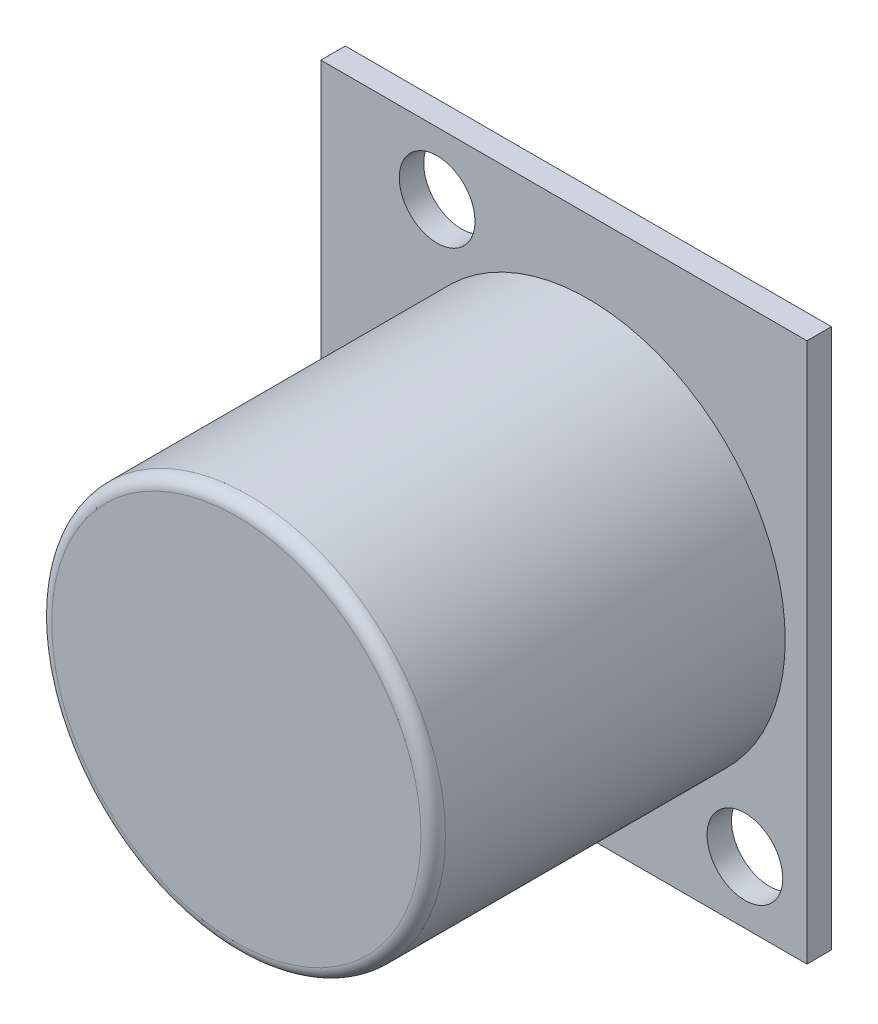
ISO-10303-21;
HEADER;
FILE_DESCRIPTION(('STEP AP214'),'2;1');
FILE_NAME('part.step','',(''),(''),'','','');
FILE_SCHEMA(('AUTOMOTIVE_DESIGN { 1 0 10303 214 1 1 1 1 }'));
ENDSEC;
DATA;
#1=APPLICATION_CONTEXT('core data for automotive mechanical design processes');
#2=APPLICATION_PROTOCOL_DEFINITION('international standard','automotive_design',2000,#1);
#3=PRODUCT_CONTEXT('',#1,'mechanical');
#4=PRODUCT('Part','Part','',(#3));
#5=PRODUCT_RELATED_PRODUCT_CATEGORY('part','',(#4));
#6=PRODUCT_DEFINITION_FORMATION('','',#4);
#7=PRODUCT_DEFINITION_CONTEXT('part definition',#1,'design');
#8=PRODUCT_DEFINITION('design','',#6,#7);
#9=PRODUCT_DEFINITION_SHAPE('','',#8);
#10=(LENGTH_UNIT() NAMED_UNIT(*) SI_UNIT(.MILLI.,.METRE.));
#11=(NAMED_UNIT(*) PLANE_ANGLE_UNIT() SI_UNIT($,.RADIAN.));
#12=(NAMED_UNIT(*) SI_UNIT($,.STERADIAN.) SOLID_ANGLE_UNIT());
#13=UNCERTAINTY_MEASURE_WITH_UNIT(LENGTH_MEASURE(1.E-05),#10,'distance_accuracy_value','');
#14=(GEOMETRIC_REPRESENTATION_CONTEXT(3) GLOBAL_UNCERTAINTY_ASSIGNED_CONTEXT((#13)) GLOBAL_UNIT_ASSIGNED_CONTEXT((#10,
#11,#12)) REPRESENTATION_CONTEXT('',''));
#15=CARTESIAN_POINT('',(0.,0.,0.));
#16=DIRECTION('',(0.,0.,1.));
#17=DIRECTION('',(1.,0.,0.));
#18=AXIS2_PLACEMENT_3D('',#15,#16,#17);
#19=CARTESIAN_POINT('',(0.,-22.1,1.));
#20=DIRECTION('',(0.,0.,1.));
#21=DIRECTION('',(1.,0.,0.));
#22=AXIS2_PLACEMENT_3D('',#19,#20,#21);
#23=PLANE('',#22);
#24=DIRECTION('',(0.,-1.,0.));
#25=VECTOR('',#24,1.);
#26=CARTESIAN_POINT('',(0.,0.,1.));
#27=LINE('',#26,#25);
#28=CARTESIAN_POINT('',(0.,0.,1.));
#29=VERTEX_POINT('',#28);
#30=CARTESIAN_POINT('',(0.,-22.1,1.));
#31=VERTEX_POINT('',#30);
#32=EDGE_CURVE('E84',#29,#31,#27,.T.);
#33=ORIENTED_EDGE('',*,*,#32,.T.);
#34=DIRECTION('',(1.,0.,0.));
#35=VECTOR('',#34,1.);
#36=CARTESIAN_POINT('',(0.,-22.1,1.));
#37=LINE('',#36,#35);
#38=CARTESIAN_POINT('',(19.9,-22.1,1.));
#39=VERTEX_POINT('',#38);
#40=EDGE_CURVE('E79',#31,#39,#37,.T.);
#41=ORIENTED_EDGE('',*,*,#40,.T.);
#42=DIRECTION('',(0.,1.,0.));
#43=VECTOR('',#42,1.);
#44=CARTESIAN_POINT('',(19.9,0.,1.));
#45=LINE('',#44,#43);
#46=CARTESIAN_POINT('',(19.9,0.,1.));
#47=VERTEX_POINT('',#46);
#48=EDGE_CURVE('E82',#39,#47,#45,.T.);
#49=ORIENTED_EDGE('',*,*,#48,.T.);
#50=DIRECTION('',(-1.,0.,0.));
#51=VECTOR('',#50,1.);
#52=CARTESIAN_POINT('',(0.,0.,1.));
#53=LINE('',#52,#51);
#54=EDGE_CURVE('E48',#47,#29,#53,.T.);
#55=ORIENTED_EDGE('',*,*,#54,.T.);
#56=EDGE_LOOP('',(#33,#41,#49,#55));
#57=FACE_BOUND('',#56,.T.);
#58=CARTESIAN_POINT('',(4.76,-2.56,1.));
#59=DIRECTION('',(0.,0.,1.));
#60=DIRECTION('',(1.,0.,0.));
#61=AXIS2_PLACEMENT_3D('',#58,#59,#60);
#62=CIRCLE('',#61,1.55);
#63=CARTESIAN_POINT('',(6.31,-2.56,1.));
#64=VERTEX_POINT('',#63);
#65=EDGE_CURVE('E224',#64,#64,#62,.T.);
#66=ORIENTED_EDGE('',*,*,#65,.F.);
#67=EDGE_LOOP('',(#66));
#68=FACE_BOUND('',#67,.T.);
#69=CARTESIAN_POINT('',(17.36,-19.56,1.));
#70=DIRECTION('',(0.,0.,1.));
#71=DIRECTION('',(1.,0.,0.));
#72=AXIS2_PLACEMENT_3D('',#69,#70,#71);
#73=CIRCLE('',#72,1.55);
#74=CARTESIAN_POINT('',(18.91,-19.56,1.));
#75=VERTEX_POINT('',#74);
#76=EDGE_CURVE('E217',#75,#75,#73,.T.);
#77=ORIENTED_EDGE('',*,*,#76,.F.);
#78=EDGE_LOOP('',(#77));
#79=FACE_BOUND('',#78,.T.);
#80=CARTESIAN_POINT('',(10.95,-11.05,1.));
#81=DIRECTION('',(0.,0.,1.));
#82=DIRECTION('',(1.,0.,0.));
#83=AXIS2_PLACEMENT_3D('',#80,#81,#82);
#84=CIRCLE('',#83,8.06);
#85=CARTESIAN_POINT('',(19.01,-11.05,1.));
#86=VERTEX_POINT('',#85);
#87=EDGE_CURVE('E215',#86,#86,#84,.T.);
#88=ORIENTED_EDGE('',*,*,#87,.F.);
#89=EDGE_LOOP('',(#88));
#90=FACE_BOUND('',#89,.T.);
#91=ADVANCED_FACE('F31',(#57,#68,#79,#90),#23,.T.);
#92=CARTESIAN_POINT('',(0.,0.,1.));
#93=DIRECTION('',(1.,0.,0.));
#94=DIRECTION('',(0.,1.,0.));
#95=AXIS2_PLACEMENT_3D('',#92,#93,#94);
#96=PLANE('',#95);
#97=DIRECTION('',(0.,-1.,0.));
#98=VECTOR('',#97,1.);
#99=CARTESIAN_POINT('',(0.,0.,0.));
#100=LINE('',#99,#98);
#101=CARTESIAN_POINT('',(0.,0.,0.));
#102=VERTEX_POINT('',#101);
#103=CARTESIAN_POINT('',(0.,-22.1,0.));
#104=VERTEX_POINT('',#103);
#105=EDGE_CURVE('E99',#102,#104,#100,.T.);
#106=ORIENTED_EDGE('',*,*,#105,.T.);
#107=DIRECTION('',(0.,0.,-1.));
#108=VECTOR('',#107,1.);
#109=CARTESIAN_POINT('',(0.,-22.1,1.));
#110=LINE('',#109,#108);
#111=EDGE_CURVE('E90',#31,#104,#110,.T.);
#112=ORIENTED_EDGE('',*,*,#111,.F.);
#113=ORIENTED_EDGE('',*,*,#32,.F.);
#114=DIRECTION('',(0.,0.,-1.));
#115=VECTOR('',#114,1.);
#116=CARTESIAN_POINT('',(0.,0.,1.));
#117=LINE('',#116,#115);
#118=EDGE_CURVE('E95',#29,#102,#117,.T.);
#119=ORIENTED_EDGE('',*,*,#118,.T.);
#120=EDGE_LOOP('',(#106,#112,#113,#119));
#121=FACE_BOUND('',#120,.T.);
#122=ADVANCED_FACE('F122',(#121),#96,.F.);
#123=CARTESIAN_POINT('',(0.,-22.1,1.));
#124=DIRECTION('',(0.,1.,0.));
#125=DIRECTION('',(0.,0.,1.));
#126=AXIS2_PLACEMENT_3D('',#123,#124,#125);
#127=PLANE('',#126);
#128=DIRECTION('',(1.,0.,0.));
#129=VECTOR('',#128,1.);
#130=CARTESIAN_POINT('',(0.,-22.1,0.));
#131=LINE('',#130,#129);
#132=CARTESIAN_POINT('',(19.9,-22.1,0.));
#133=VERTEX_POINT('',#132);
#134=EDGE_CURVE('E89',#104,#133,#131,.T.);
#135=ORIENTED_EDGE('',*,*,#134,.T.);
#136=DIRECTION('',(0.,0.,-1.));
#137=VECTOR('',#136,1.);
#138=CARTESIAN_POINT('',(19.9,-22.1,1.));
#139=LINE('',#138,#137);
#140=EDGE_CURVE('E87',#39,#133,#139,.T.);
#141=ORIENTED_EDGE('',*,*,#140,.F.);
#142=ORIENTED_EDGE('',*,*,#40,.F.);
#143=ORIENTED_EDGE('',*,*,#111,.T.);
#144=EDGE_LOOP('',(#135,#141,#142,#143));
#145=FACE_BOUND('',#144,.T.);
#146=ADVANCED_FACE('F88',(#145),#127,.F.);
#147=CARTESIAN_POINT('',(19.9,0.,1.));
#148=DIRECTION('',(-1.,0.,0.));
#149=DIRECTION('',(0.,0.,1.));
#150=AXIS2_PLACEMENT_3D('',#147,#148,#149);
#151=PLANE('',#150);
#152=DIRECTION('',(0.,1.,0.));
#153=VECTOR('',#152,1.);
#154=CARTESIAN_POINT('',(19.9,0.,0.));
#155=LINE('',#154,#153);
#156=CARTESIAN_POINT('',(19.9,0.,0.));
#157=VERTEX_POINT('',#156);
#158=EDGE_CURVE('E65',#133,#157,#155,.T.);
#159=ORIENTED_EDGE('',*,*,#158,.T.);
#160=DIRECTION('',(0.,0.,-1.));
#161=VECTOR('',#160,1.);
#162=CARTESIAN_POINT('',(19.9,0.,1.));
#163=LINE('',#162,#161);
#164=EDGE_CURVE('E91',#47,#157,#163,.T.);
#165=ORIENTED_EDGE('',*,*,#164,.F.);
#166=ORIENTED_EDGE('',*,*,#48,.F.);
#167=ORIENTED_EDGE('',*,*,#140,.T.);
#168=EDGE_LOOP('',(#159,#165,#166,#167));
#169=FACE_BOUND('',#168,.T.);
#170=ADVANCED_FACE('F93',(#169),#151,.F.);
#171=CARTESIAN_POINT('',(0.,0.,1.));
#172=DIRECTION('',(0.,-1.,0.));
#173=DIRECTION('',(0.,0.,-1.));
#174=AXIS2_PLACEMENT_3D('',#171,#172,#173);
#175=PLANE('',#174);
#176=DIRECTION('',(-1.,0.,0.));
#177=VECTOR('',#176,1.);
#178=CARTESIAN_POINT('',(0.,0.,0.));
#179=LINE('',#178,#177);
#180=EDGE_CURVE('E71',#157,#102,#179,.T.);
#181=ORIENTED_EDGE('',*,*,#180,.T.);
#182=ORIENTED_EDGE('',*,*,#118,.F.);
#183=ORIENTED_EDGE('',*,*,#54,.F.);
#184=ORIENTED_EDGE('',*,*,#164,.T.);
#185=EDGE_LOOP('',(#181,#182,#183,#184));
#186=FACE_BOUND('',#185,.T.);
#187=ADVANCED_FACE('F135',(#186),#175,.F.);
#188=CARTESIAN_POINT('',(0.,-22.1,0.));
#189=DIRECTION('',(0.,0.,1.));
#190=DIRECTION('',(1.,0.,0.));
#191=AXIS2_PLACEMENT_3D('',#188,#189,#190);
#192=PLANE('',#191);
#193=CARTESIAN_POINT('',(17.36,-19.56,0.));
#194=DIRECTION('',(0.,0.,1.));
#195=DIRECTION('',(1.,0.,0.));
#196=AXIS2_PLACEMENT_3D('',#193,#194,#195);
#197=CIRCLE('',#196,1.55);
#198=CARTESIAN_POINT('',(18.91,-19.56,0.));
#199=VERTEX_POINT('',#198);
#200=EDGE_CURVE('E220',#199,#199,#197,.T.);
#201=ORIENTED_EDGE('',*,*,#200,.T.);
#202=EDGE_LOOP('',(#201));
#203=FACE_BOUND('',#202,.T.);
#204=CARTESIAN_POINT('',(4.76,-2.56,0.));
#205=DIRECTION('',(0.,0.,1.));
#206=DIRECTION('',(1.,0.,0.));
#207=AXIS2_PLACEMENT_3D('',#204,#205,#206);
#208=CIRCLE('',#207,1.55);
#209=CARTESIAN_POINT('',(6.31,-2.56,0.));
#210=VERTEX_POINT('',#209);
#211=EDGE_CURVE('E102',#210,#210,#208,.T.);
#212=ORIENTED_EDGE('',*,*,#211,.T.);
#213=EDGE_LOOP('',(#212));
#214=FACE_BOUND('',#213,.T.);
#215=ORIENTED_EDGE('',*,*,#105,.F.);
#216=ORIENTED_EDGE('',*,*,#180,.F.);
#217=ORIENTED_EDGE('',*,*,#158,.F.);
#218=ORIENTED_EDGE('',*,*,#134,.F.);
#219=EDGE_LOOP('',(#215,#216,#217,#218));
#220=FACE_BOUND('',#219,.T.);
#221=ADVANCED_FACE('F132',(#203,#214,#220),#192,.F.);
#222=CARTESIAN_POINT('',(4.76,-2.56,0.));
#223=DIRECTION('',(0.,0.,1.));
#224=DIRECTION('',(1.,0.,0.));
#225=AXIS2_PLACEMENT_3D('',#222,#223,#224);
#226=CYLINDRICAL_SURFACE('',#225,1.55);
#227=ORIENTED_EDGE('',*,*,#211,.F.);
#228=EDGE_LOOP('',(#227));
#229=FACE_BOUND('',#228,.T.);
#230=ORIENTED_EDGE('',*,*,#65,.T.);
#231=EDGE_LOOP('',(#230));
#232=FACE_BOUND('',#231,.T.);
#233=ADVANCED_FACE('F130',(#229,#232),#226,.F.);
#234=CARTESIAN_POINT('',(17.36,-19.56,0.));
#235=DIRECTION('',(0.,0.,1.));
#236=DIRECTION('',(1.,0.,0.));
#237=AXIS2_PLACEMENT_3D('',#234,#235,#236);
#238=CYLINDRICAL_SURFACE('',#237,1.55);
#239=ORIENTED_EDGE('',*,*,#200,.F.);
#240=EDGE_LOOP('',(#239));
#241=FACE_BOUND('',#240,.T.);
#242=ORIENTED_EDGE('',*,*,#76,.T.);
#243=EDGE_LOOP('',(#242));
#244=FACE_BOUND('',#243,.T.);
#245=ADVANCED_FACE('F164',(#241,#244),#238,.F.);
#246=CARTESIAN_POINT('',(10.95,-11.05,15.41));
#247=DIRECTION('',(0.,0.,-1.));
#248=DIRECTION('',(-1.,0.,0.));
#249=AXIS2_PLACEMENT_3D('',#246,#247,#248);
#250=CYLINDRICAL_SURFACE('',#249,8.06);
#251=CARTESIAN_POINT('',(10.95,-11.05,14.91));
#252=DIRECTION('',(0.,0.,1.));
#253=DIRECTION('',(1.,0.,0.));
#254=AXIS2_PLACEMENT_3D('',#251,#252,#253);
#255=CIRCLE('',#254,8.06);
#256=CARTESIAN_POINT('',(19.01,-11.05,14.91));
#257=VERTEX_POINT('',#256);
#258=EDGE_CURVE('E11',#257,#257,#255,.F.);
#259=ORIENTED_EDGE('',*,*,#258,.T.);
#260=EDGE_LOOP('',(#259));
#261=FACE_BOUND('',#260,.T.);
#262=ORIENTED_EDGE('',*,*,#87,.T.);
#263=EDGE_LOOP('',(#262));
#264=FACE_BOUND('',#263,.T.);
#265=ADVANCED_FACE('F118',(#261,#264),#250,.T.);
#266=CARTESIAN_POINT('',(10.95,-11.05,15.41));
#267=DIRECTION('',(0.,0.,1.));
#268=DIRECTION('',(1.,0.,0.));
#269=AXIS2_PLACEMENT_3D('',#266,#267,#268);
#270=PLANE('',#269);
#271=CARTESIAN_POINT('',(10.95,-11.05,15.41));
#272=DIRECTION('',(0.,0.,1.));
#273=DIRECTION('',(1.,0.,0.));
#274=AXIS2_PLACEMENT_3D('',#271,#272,#273);
#275=CIRCLE('',#274,7.56);
#276=CARTESIAN_POINT('',(18.51,-11.05,15.41));
#277=VERTEX_POINT('',#276);
#278=EDGE_CURVE('E40',#277,#277,#275,.T.);
#279=ORIENTED_EDGE('',*,*,#278,.T.);
#280=EDGE_LOOP('',(#279));
#281=FACE_BOUND('',#280,.T.);
#282=ADVANCED_FACE('F111',(#281),#270,.T.);
#283=CARTESIAN_POINT('',(10.95,-11.05,14.91));
#284=DIRECTION('',(0.,0.,1.));
#285=DIRECTION('',(1.,0.,0.));
#286=AXIS2_PLACEMENT_3D('',#283,#284,#285);
#287=TOROIDAL_SURFACE('',#286,7.56,0.5);
#288=ORIENTED_EDGE('',*,*,#258,.F.);
#289=EDGE_LOOP('',(#288));
#290=FACE_BOUND('',#289,.T.);
#291=ORIENTED_EDGE('',*,*,#278,.F.);
#292=EDGE_LOOP('',(#291));
#293=FACE_BOUND('',#292,.T.);
#294=ADVANCED_FACE('F33',(#290,#293),#287,.T.);
#295=CLOSED_SHELL('',(#91,#122,#146,#170,#187,#221,#233,#245,#265,#282,#294));
#296=MANIFOLD_SOLID_BREP('B2',#295);
#297=ADVANCED_BREP_SHAPE_REPRESENTATION('',(#18,#296),#14);
#298=SHAPE_DEFINITION_REPRESENTATION(#9,#297);
ENDSEC;
END-ISO-10303-21;
